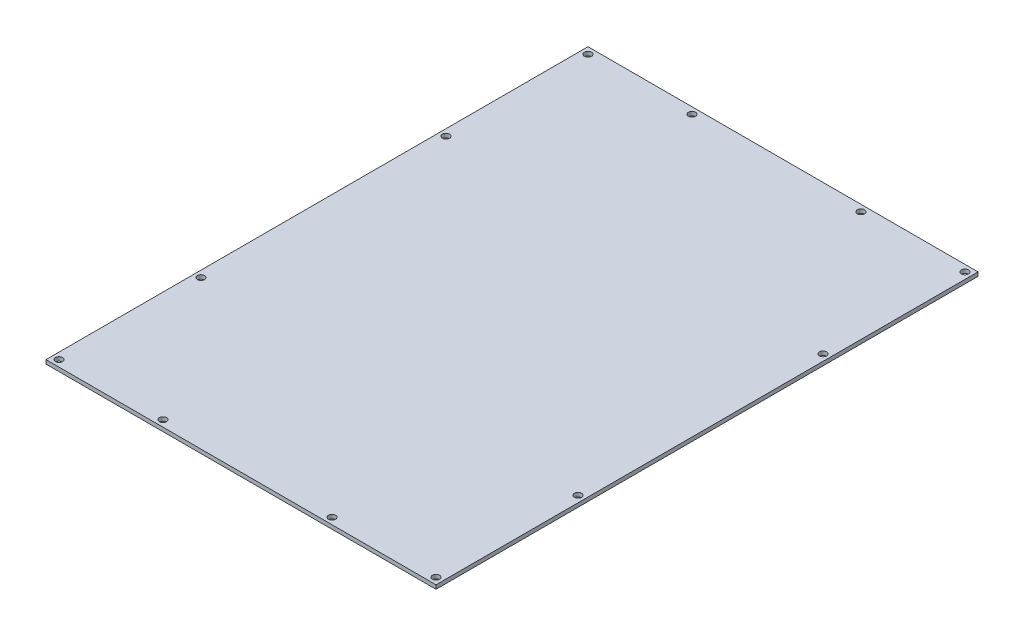
ISO-10303-21;
HEADER;
FILE_DESCRIPTION(('STEP AP214'),'2;1');
FILE_NAME('part.step','',(''),(''),'','','');
FILE_SCHEMA(('AUTOMOTIVE_DESIGN { 1 0 10303 214 1 1 1 1 }'));
ENDSEC;
DATA;
#1=APPLICATION_CONTEXT('core data for automotive mechanical design processes');
#2=APPLICATION_PROTOCOL_DEFINITION('international standard','automotive_design',2000,#1);
#3=PRODUCT_CONTEXT('',#1,'mechanical');
#4=PRODUCT('Part','Part','',(#3));
#5=PRODUCT_RELATED_PRODUCT_CATEGORY('part','',(#4));
#6=PRODUCT_DEFINITION_FORMATION('','',#4);
#7=PRODUCT_DEFINITION_CONTEXT('part definition',#1,'design');
#8=PRODUCT_DEFINITION('design','',#6,#7);
#9=PRODUCT_DEFINITION_SHAPE('','',#8);
#10=(LENGTH_UNIT() NAMED_UNIT(*) SI_UNIT(.MILLI.,.METRE.));
#11=(NAMED_UNIT(*) PLANE_ANGLE_UNIT() SI_UNIT($,.RADIAN.));
#12=(NAMED_UNIT(*) SI_UNIT($,.STERADIAN.) SOLID_ANGLE_UNIT());
#13=UNCERTAINTY_MEASURE_WITH_UNIT(LENGTH_MEASURE(1.E-05),#10,'distance_accuracy_value','');
#14=(GEOMETRIC_REPRESENTATION_CONTEXT(3) GLOBAL_UNCERTAINTY_ASSIGNED_CONTEXT((#13)) GLOBAL_UNIT_ASSIGNED_CONTEXT((#10,
#11,#12)) REPRESENTATION_CONTEXT('',''));
#15=CARTESIAN_POINT('',(0.,0.,0.));
#16=DIRECTION('',(0.,0.,1.));
#17=DIRECTION('',(1.,0.,0.));
#18=AXIS2_PLACEMENT_3D('',#15,#16,#17);
#19=CARTESIAN_POINT('',(150.,3.,-208.45));
#20=DIRECTION('',(-1.,0.,0.));
#21=DIRECTION('',(0.,0.,1.));
#22=AXIS2_PLACEMENT_3D('',#19,#20,#21);
#23=PLANE('',#22);
#24=DIRECTION('',(0.,0.,-1.));
#25=VECTOR('',#24,1.);
#26=CARTESIAN_POINT('',(150.,0.,-208.45));
#27=LINE('',#26,#25);
#28=CARTESIAN_POINT('',(150.,0.,208.45));
#29=VERTEX_POINT('',#28);
#30=CARTESIAN_POINT('',(150.,0.,-208.45));
#31=VERTEX_POINT('',#30);
#32=EDGE_CURVE('E107',#29,#31,#27,.T.);
#33=ORIENTED_EDGE('',*,*,#32,.T.);
#34=DIRECTION('',(0.,-1.,0.));
#35=VECTOR('',#34,1.);
#36=CARTESIAN_POINT('',(150.,3.,-208.45));
#37=LINE('',#36,#35);
#38=CARTESIAN_POINT('',(150.,3.,-208.45));
#39=VERTEX_POINT('',#38);
#40=EDGE_CURVE('E11',#39,#31,#37,.T.);
#41=ORIENTED_EDGE('',*,*,#40,.F.);
#42=DIRECTION('',(0.,0.,-1.));
#43=VECTOR('',#42,1.);
#44=CARTESIAN_POINT('',(150.,3.,-208.45));
#45=LINE('',#44,#43);
#46=CARTESIAN_POINT('',(150.,3.,208.45));
#47=VERTEX_POINT('',#46);
#48=EDGE_CURVE('E94',#47,#39,#45,.T.);
#49=ORIENTED_EDGE('',*,*,#48,.F.);
#50=DIRECTION('',(0.,-1.,0.));
#51=VECTOR('',#50,1.);
#52=CARTESIAN_POINT('',(150.,3.,208.45));
#53=LINE('',#52,#51);
#54=EDGE_CURVE('E103',#47,#29,#53,.T.);
#55=ORIENTED_EDGE('',*,*,#54,.T.);
#56=EDGE_LOOP('',(#33,#41,#49,#55));
#57=FACE_BOUND('',#56,.T.);
#58=ADVANCED_FACE('F41',(#57),#23,.F.);
#59=CARTESIAN_POINT('',(-150.,3.,-208.45));
#60=DIRECTION('',(0.,0.,1.));
#61=DIRECTION('',(1.,0.,0.));
#62=AXIS2_PLACEMENT_3D('',#59,#60,#61);
#63=PLANE('',#62);
#64=DIRECTION('',(-1.,0.,0.));
#65=VECTOR('',#64,1.);
#66=CARTESIAN_POINT('',(-150.,0.,-208.45));
#67=LINE('',#66,#65);
#68=CARTESIAN_POINT('',(-150.,0.,-208.45));
#69=VERTEX_POINT('',#68);
#70=EDGE_CURVE('E98',#31,#69,#67,.T.);
#71=ORIENTED_EDGE('',*,*,#70,.T.);
#72=DIRECTION('',(0.,-1.,0.));
#73=VECTOR('',#72,1.);
#74=CARTESIAN_POINT('',(-150.,3.,-208.45));
#75=LINE('',#74,#73);
#76=CARTESIAN_POINT('',(-150.,3.,-208.45));
#77=VERTEX_POINT('',#76);
#78=EDGE_CURVE('E50',#77,#69,#75,.T.);
#79=ORIENTED_EDGE('',*,*,#78,.F.);
#80=DIRECTION('',(-1.,0.,0.));
#81=VECTOR('',#80,1.);
#82=CARTESIAN_POINT('',(-150.,3.,-208.45));
#83=LINE('',#82,#81);
#84=EDGE_CURVE('E89',#39,#77,#83,.T.);
#85=ORIENTED_EDGE('',*,*,#84,.F.);
#86=ORIENTED_EDGE('',*,*,#40,.T.);
#87=EDGE_LOOP('',(#71,#79,#85,#86));
#88=FACE_BOUND('',#87,.T.);
#89=ADVANCED_FACE('F97',(#88),#63,.F.);
#90=CARTESIAN_POINT('',(-150.,3.,-208.45));
#91=DIRECTION('',(1.,0.,0.));
#92=DIRECTION('',(0.,0.,-1.));
#93=AXIS2_PLACEMENT_3D('',#90,#91,#92);
#94=PLANE('',#93);
#95=DIRECTION('',(0.,0.,1.));
#96=VECTOR('',#95,1.);
#97=CARTESIAN_POINT('',(-150.,0.,-208.45));
#98=LINE('',#97,#96);
#99=CARTESIAN_POINT('',(-150.,0.,208.45));
#100=VERTEX_POINT('',#99);
#101=EDGE_CURVE('E76',#69,#100,#98,.T.);
#102=ORIENTED_EDGE('',*,*,#101,.T.);
#103=DIRECTION('',(0.,-1.,0.));
#104=VECTOR('',#103,1.);
#105=CARTESIAN_POINT('',(-150.,3.,208.45));
#106=LINE('',#105,#104);
#107=CARTESIAN_POINT('',(-150.,3.,208.45));
#108=VERTEX_POINT('',#107);
#109=EDGE_CURVE('E99',#108,#100,#106,.T.);
#110=ORIENTED_EDGE('',*,*,#109,.F.);
#111=DIRECTION('',(0.,0.,1.));
#112=VECTOR('',#111,1.);
#113=CARTESIAN_POINT('',(-150.,3.,-208.45));
#114=LINE('',#113,#112);
#115=EDGE_CURVE('E92',#77,#108,#114,.T.);
#116=ORIENTED_EDGE('',*,*,#115,.F.);
#117=ORIENTED_EDGE('',*,*,#78,.T.);
#118=EDGE_LOOP('',(#102,#110,#116,#117));
#119=FACE_BOUND('',#118,.T.);
#120=ADVANCED_FACE('F101',(#119),#94,.F.);
#121=CARTESIAN_POINT('',(-150.,3.,208.45));
#122=DIRECTION('',(0.,0.,-1.));
#123=DIRECTION('',(-1.,0.,0.));
#124=AXIS2_PLACEMENT_3D('',#121,#122,#123);
#125=PLANE('',#124);
#126=DIRECTION('',(1.,0.,0.));
#127=VECTOR('',#126,1.);
#128=CARTESIAN_POINT('',(-150.,0.,208.45));
#129=LINE('',#128,#127);
#130=EDGE_CURVE('E82',#100,#29,#129,.T.);
#131=ORIENTED_EDGE('',*,*,#130,.T.);
#132=ORIENTED_EDGE('',*,*,#54,.F.);
#133=DIRECTION('',(1.,0.,0.));
#134=VECTOR('',#133,1.);
#135=CARTESIAN_POINT('',(-150.,3.,208.45));
#136=LINE('',#135,#134);
#137=EDGE_CURVE('E59',#108,#47,#136,.T.);
#138=ORIENTED_EDGE('',*,*,#137,.F.);
#139=ORIENTED_EDGE('',*,*,#109,.T.);
#140=EDGE_LOOP('',(#131,#132,#138,#139));
#141=FACE_BOUND('',#140,.T.);
#142=ADVANCED_FACE('F193',(#141),#125,.F.);
#143=CARTESIAN_POINT('',(0.,3.,0.));
#144=DIRECTION('',(0.,1.,0.));
#145=DIRECTION('',(0.,0.,1.));
#146=AXIS2_PLACEMENT_3D('',#143,#144,#145);
#147=PLANE('',#146);
#148=CARTESIAN_POINT('',(-145.,3.,-203.45));
#149=DIRECTION('',(0.,1.,0.));
#150=DIRECTION('',(0.,0.,1.));
#151=AXIS2_PLACEMENT_3D('',#148,#149,#150);
#152=CIRCLE('',#151,2.75);
#153=CARTESIAN_POINT('',(-145.,3.,-200.7));
#154=VERTEX_POINT('',#153);
#155=EDGE_CURVE('E163',#154,#154,#152,.T.);
#156=ORIENTED_EDGE('',*,*,#155,.F.);
#157=EDGE_LOOP('',(#156));
#158=FACE_BOUND('',#157,.T.);
#159=CARTESIAN_POINT('',(145.,3.,203.45));
#160=DIRECTION('',(0.,1.,0.));
#161=DIRECTION('',(0.,0.,1.));
#162=AXIS2_PLACEMENT_3D('',#159,#160,#161);
#163=CIRCLE('',#162,2.75);
#164=CARTESIAN_POINT('',(145.,3.,206.2));
#165=VERTEX_POINT('',#164);
#166=EDGE_CURVE('E153',#165,#165,#163,.T.);
#167=ORIENTED_EDGE('',*,*,#166,.F.);
#168=EDGE_LOOP('',(#167));
#169=FACE_BOUND('',#168,.T.);
#170=CARTESIAN_POINT('',(-145.,3.,203.45));
#171=DIRECTION('',(0.,1.,0.));
#172=DIRECTION('',(0.,0.,1.));
#173=AXIS2_PLACEMENT_3D('',#170,#171,#172);
#174=CIRCLE('',#173,2.75);
#175=CARTESIAN_POINT('',(-145.,3.,206.2));
#176=VERTEX_POINT('',#175);
#177=EDGE_CURVE('E150',#176,#176,#174,.T.);
#178=ORIENTED_EDGE('',*,*,#177,.F.);
#179=EDGE_LOOP('',(#178));
#180=FACE_BOUND('',#179,.T.);
#181=CARTESIAN_POINT('',(145.,3.,-203.45));
#182=DIRECTION('',(0.,1.,0.));
#183=DIRECTION('',(0.,0.,1.));
#184=AXIS2_PLACEMENT_3D('',#181,#182,#183);
#185=CIRCLE('',#184,2.75);
#186=CARTESIAN_POINT('',(145.,3.,-200.7));
#187=VERTEX_POINT('',#186);
#188=EDGE_CURVE('E147',#187,#187,#185,.T.);
#189=ORIENTED_EDGE('',*,*,#188,.F.);
#190=EDGE_LOOP('',(#189));
#191=FACE_BOUND('',#190,.T.);
#192=CARTESIAN_POINT('',(-65.,3.,-203.45));
#193=DIRECTION('',(0.,1.,0.));
#194=DIRECTION('',(0.,0.,1.));
#195=AXIS2_PLACEMENT_3D('',#192,#193,#194);
#196=CIRCLE('',#195,2.75);
#197=CARTESIAN_POINT('',(-65.,3.,-200.7));
#198=VERTEX_POINT('',#197);
#199=EDGE_CURVE('E143',#198,#198,#196,.T.);
#200=ORIENTED_EDGE('',*,*,#199,.F.);
#201=EDGE_LOOP('',(#200));
#202=FACE_BOUND('',#201,.T.);
#203=CARTESIAN_POINT('',(65.,3.,-203.45));
#204=DIRECTION('',(0.,1.,0.));
#205=DIRECTION('',(0.,0.,1.));
#206=AXIS2_PLACEMENT_3D('',#203,#204,#205);
#207=CIRCLE('',#206,2.75);
#208=CARTESIAN_POINT('',(65.,3.,-200.7));
#209=VERTEX_POINT('',#208);
#210=EDGE_CURVE('E139',#209,#209,#207,.T.);
#211=ORIENTED_EDGE('',*,*,#210,.F.);
#212=EDGE_LOOP('',(#211));
#213=FACE_BOUND('',#212,.T.);
#214=CARTESIAN_POINT('',(-145.,3.,-94.22));
#215=DIRECTION('',(0.,1.,0.));
#216=DIRECTION('',(0.,0.,1.));
#217=AXIS2_PLACEMENT_3D('',#214,#215,#216);
#218=CIRCLE('',#217,2.75);
#219=CARTESIAN_POINT('',(-145.,3.,-91.47));
#220=VERTEX_POINT('',#219);
#221=EDGE_CURVE('E135',#220,#220,#218,.T.);
#222=ORIENTED_EDGE('',*,*,#221,.F.);
#223=EDGE_LOOP('',(#222));
#224=FACE_BOUND('',#223,.T.);
#225=CARTESIAN_POINT('',(-145.,3.,94.2199999999999));
#226=DIRECTION('',(0.,1.,0.));
#227=DIRECTION('',(0.,0.,1.));
#228=AXIS2_PLACEMENT_3D('',#225,#226,#227);
#229=CIRCLE('',#228,2.75);
#230=CARTESIAN_POINT('',(-145.,3.,96.9699999999999));
#231=VERTEX_POINT('',#230);
#232=EDGE_CURVE('E131',#231,#231,#229,.T.);
#233=ORIENTED_EDGE('',*,*,#232,.F.);
#234=EDGE_LOOP('',(#233));
#235=FACE_BOUND('',#234,.T.);
#236=CARTESIAN_POINT('',(145.,3.,-94.22));
#237=DIRECTION('',(0.,1.,0.));
#238=DIRECTION('',(0.,0.,1.));
#239=AXIS2_PLACEMENT_3D('',#236,#237,#238);
#240=CIRCLE('',#239,2.75);
#241=CARTESIAN_POINT('',(145.,3.,-91.47));
#242=VERTEX_POINT('',#241);
#243=EDGE_CURVE('E130',#242,#242,#240,.T.);
#244=ORIENTED_EDGE('',*,*,#243,.F.);
#245=EDGE_LOOP('',(#244));
#246=FACE_BOUND('',#245,.T.);
#247=CARTESIAN_POINT('',(145.,3.,94.2199999999999));
#248=DIRECTION('',(0.,1.,0.));
#249=DIRECTION('',(0.,0.,1.));
#250=AXIS2_PLACEMENT_3D('',#247,#248,#249);
#251=CIRCLE('',#250,2.75);
#252=CARTESIAN_POINT('',(145.,3.,96.9699999999999));
#253=VERTEX_POINT('',#252);
#254=EDGE_CURVE('E126',#253,#253,#251,.T.);
#255=ORIENTED_EDGE('',*,*,#254,.F.);
#256=EDGE_LOOP('',(#255));
#257=FACE_BOUND('',#256,.T.);
#258=CARTESIAN_POINT('',(-65.,3.,203.45));
#259=DIRECTION('',(0.,1.,0.));
#260=DIRECTION('',(0.,0.,1.));
#261=AXIS2_PLACEMENT_3D('',#258,#259,#260);
#262=CIRCLE('',#261,2.75);
#263=CARTESIAN_POINT('',(-65.,3.,206.2));
#264=VERTEX_POINT('',#263);
#265=EDGE_CURVE('E122',#264,#264,#262,.T.);
#266=ORIENTED_EDGE('',*,*,#265,.F.);
#267=EDGE_LOOP('',(#266));
#268=FACE_BOUND('',#267,.T.);
#269=CARTESIAN_POINT('',(65.,3.,203.45));
#270=DIRECTION('',(0.,1.,0.));
#271=DIRECTION('',(0.,0.,1.));
#272=AXIS2_PLACEMENT_3D('',#269,#270,#271);
#273=CIRCLE('',#272,2.75);
#274=CARTESIAN_POINT('',(65.,3.,206.2));
#275=VERTEX_POINT('',#274);
#276=EDGE_CURVE('E118',#275,#275,#273,.T.);
#277=ORIENTED_EDGE('',*,*,#276,.F.);
#278=EDGE_LOOP('',(#277));
#279=FACE_BOUND('',#278,.T.);
#280=ORIENTED_EDGE('',*,*,#48,.T.);
#281=ORIENTED_EDGE('',*,*,#84,.T.);
#282=ORIENTED_EDGE('',*,*,#115,.T.);
#283=ORIENTED_EDGE('',*,*,#137,.T.);
#284=EDGE_LOOP('',(#280,#281,#282,#283));
#285=FACE_BOUND('',#284,.T.);
#286=ADVANCED_FACE('F90',(#158,#169,#180,#191,#202,#213,#224,#235,#246,#257,#268,#279,#285),
#147,.T.);
#287=CARTESIAN_POINT('',(0.,0.,0.));
#288=DIRECTION('',(0.,1.,0.));
#289=DIRECTION('',(0.,0.,1.));
#290=AXIS2_PLACEMENT_3D('',#287,#288,#289);
#291=PLANE('',#290);
#292=CARTESIAN_POINT('',(-145.,0.,-203.45));
#293=DIRECTION('',(0.,1.,0.));
#294=DIRECTION('',(0.,0.,1.));
#295=AXIS2_PLACEMENT_3D('',#292,#293,#294);
#296=CIRCLE('',#295,2.75);
#297=CARTESIAN_POINT('',(-145.,0.,-200.7));
#298=VERTEX_POINT('',#297);
#299=EDGE_CURVE('E44',#298,#298,#296,.T.);
#300=ORIENTED_EDGE('',*,*,#299,.T.);
#301=EDGE_LOOP('',(#300));
#302=FACE_BOUND('',#301,.T.);
#303=CARTESIAN_POINT('',(145.,0.,203.45));
#304=DIRECTION('',(0.,1.,0.));
#305=DIRECTION('',(0.,0.,1.));
#306=AXIS2_PLACEMENT_3D('',#303,#304,#305);
#307=CIRCLE('',#306,2.75);
#308=CARTESIAN_POINT('',(145.,0.,206.2));
#309=VERTEX_POINT('',#308);
#310=EDGE_CURVE('E151',#309,#309,#307,.T.);
#311=ORIENTED_EDGE('',*,*,#310,.T.);
#312=EDGE_LOOP('',(#311));
#313=FACE_BOUND('',#312,.T.);
#314=CARTESIAN_POINT('',(-145.,0.,203.45));
#315=DIRECTION('',(0.,1.,0.));
#316=DIRECTION('',(0.,0.,1.));
#317=AXIS2_PLACEMENT_3D('',#314,#315,#316);
#318=CIRCLE('',#317,2.75);
#319=CARTESIAN_POINT('',(-145.,0.,206.2));
#320=VERTEX_POINT('',#319);
#321=EDGE_CURVE('E148',#320,#320,#318,.T.);
#322=ORIENTED_EDGE('',*,*,#321,.T.);
#323=EDGE_LOOP('',(#322));
#324=FACE_BOUND('',#323,.T.);
#325=CARTESIAN_POINT('',(145.,0.,-203.45));
#326=DIRECTION('',(0.,1.,0.));
#327=DIRECTION('',(0.,0.,1.));
#328=AXIS2_PLACEMENT_3D('',#325,#326,#327);
#329=CIRCLE('',#328,2.75);
#330=CARTESIAN_POINT('',(145.,0.,-200.7));
#331=VERTEX_POINT('',#330);
#332=EDGE_CURVE('E144',#331,#331,#329,.T.);
#333=ORIENTED_EDGE('',*,*,#332,.T.);
#334=EDGE_LOOP('',(#333));
#335=FACE_BOUND('',#334,.T.);
#336=CARTESIAN_POINT('',(-65.,0.,-203.45));
#337=DIRECTION('',(0.,1.,0.));
#338=DIRECTION('',(0.,0.,1.));
#339=AXIS2_PLACEMENT_3D('',#336,#337,#338);
#340=CIRCLE('',#339,2.75);
#341=CARTESIAN_POINT('',(-65.,0.,-200.7));
#342=VERTEX_POINT('',#341);
#343=EDGE_CURVE('E140',#342,#342,#340,.T.);
#344=ORIENTED_EDGE('',*,*,#343,.T.);
#345=EDGE_LOOP('',(#344));
#346=FACE_BOUND('',#345,.T.);
#347=CARTESIAN_POINT('',(65.,0.,-203.45));
#348=DIRECTION('',(0.,1.,0.));
#349=DIRECTION('',(0.,0.,1.));
#350=AXIS2_PLACEMENT_3D('',#347,#348,#349);
#351=CIRCLE('',#350,2.75);
#352=CARTESIAN_POINT('',(65.,0.,-200.7));
#353=VERTEX_POINT('',#352);
#354=EDGE_CURVE('E136',#353,#353,#351,.T.);
#355=ORIENTED_EDGE('',*,*,#354,.T.);
#356=EDGE_LOOP('',(#355));
#357=FACE_BOUND('',#356,.T.);
#358=CARTESIAN_POINT('',(-145.,0.,-94.22));
#359=DIRECTION('',(0.,1.,0.));
#360=DIRECTION('',(0.,0.,1.));
#361=AXIS2_PLACEMENT_3D('',#358,#359,#360);
#362=CIRCLE('',#361,2.75);
#363=CARTESIAN_POINT('',(-145.,0.,-91.47));
#364=VERTEX_POINT('',#363);
#365=EDGE_CURVE('E132',#364,#364,#362,.T.);
#366=ORIENTED_EDGE('',*,*,#365,.T.);
#367=EDGE_LOOP('',(#366));
#368=FACE_BOUND('',#367,.T.);
#369=CARTESIAN_POINT('',(-145.,0.,94.2199999999999));
#370=DIRECTION('',(0.,1.,0.));
#371=DIRECTION('',(0.,0.,1.));
#372=AXIS2_PLACEMENT_3D('',#369,#370,#371);
#373=CIRCLE('',#372,2.75);
#374=CARTESIAN_POINT('',(-145.,0.,96.9699999999999));
#375=VERTEX_POINT('',#374);
#376=EDGE_CURVE('E127',#375,#375,#373,.T.);
#377=ORIENTED_EDGE('',*,*,#376,.T.);
#378=EDGE_LOOP('',(#377));
#379=FACE_BOUND('',#378,.T.);
#380=CARTESIAN_POINT('',(145.,0.,-94.22));
#381=DIRECTION('',(0.,1.,0.));
#382=DIRECTION('',(0.,0.,1.));
#383=AXIS2_PLACEMENT_3D('',#380,#381,#382);
#384=CIRCLE('',#383,2.75);
#385=CARTESIAN_POINT('',(145.,0.,-91.47));
#386=VERTEX_POINT('',#385);
#387=EDGE_CURVE('E178',#386,#386,#384,.T.);
#388=ORIENTED_EDGE('',*,*,#387,.T.);
#389=EDGE_LOOP('',(#388));
#390=FACE_BOUND('',#389,.T.);
#391=CARTESIAN_POINT('',(145.,0.,94.2199999999999));
#392=DIRECTION('',(0.,1.,0.));
#393=DIRECTION('',(0.,0.,1.));
#394=AXIS2_PLACEMENT_3D('',#391,#392,#393);
#395=CIRCLE('',#394,2.75);
#396=CARTESIAN_POINT('',(145.,0.,96.9699999999999));
#397=VERTEX_POINT('',#396);
#398=EDGE_CURVE('E123',#397,#397,#395,.T.);
#399=ORIENTED_EDGE('',*,*,#398,.T.);
#400=EDGE_LOOP('',(#399));
#401=FACE_BOUND('',#400,.T.);
#402=CARTESIAN_POINT('',(-65.,0.,203.45));
#403=DIRECTION('',(0.,1.,0.));
#404=DIRECTION('',(0.,0.,1.));
#405=AXIS2_PLACEMENT_3D('',#402,#403,#404);
#406=CIRCLE('',#405,2.75);
#407=CARTESIAN_POINT('',(-65.,0.,206.2));
#408=VERTEX_POINT('',#407);
#409=EDGE_CURVE('E119',#408,#408,#406,.T.);
#410=ORIENTED_EDGE('',*,*,#409,.T.);
#411=EDGE_LOOP('',(#410));
#412=FACE_BOUND('',#411,.T.);
#413=CARTESIAN_POINT('',(65.,0.,203.45));
#414=DIRECTION('',(0.,1.,0.));
#415=DIRECTION('',(0.,0.,1.));
#416=AXIS2_PLACEMENT_3D('',#413,#414,#415);
#417=CIRCLE('',#416,2.75);
#418=CARTESIAN_POINT('',(65.,0.,206.2));
#419=VERTEX_POINT('',#418);
#420=EDGE_CURVE('E110',#419,#419,#417,.T.);
#421=ORIENTED_EDGE('',*,*,#420,.T.);
#422=EDGE_LOOP('',(#421));
#423=FACE_BOUND('',#422,.T.);
#424=ORIENTED_EDGE('',*,*,#32,.F.);
#425=ORIENTED_EDGE('',*,*,#130,.F.);
#426=ORIENTED_EDGE('',*,*,#101,.F.);
#427=ORIENTED_EDGE('',*,*,#70,.F.);
#428=EDGE_LOOP('',(#424,#425,#426,#427));
#429=FACE_BOUND('',#428,.T.);
#430=ADVANCED_FACE('F192',(#302,#313,#324,#335,#346,#357,#368,#379,#390,#401,#412,#423,#429),
#291,.F.);
#431=CARTESIAN_POINT('',(65.,3.,203.45));
#432=DIRECTION('',(0.,1.,0.));
#433=DIRECTION('',(0.,0.,1.));
#434=AXIS2_PLACEMENT_3D('',#431,#432,#433);
#435=CYLINDRICAL_SURFACE('',#434,2.75);
#436=ORIENTED_EDGE('',*,*,#276,.T.);
#437=EDGE_LOOP('',(#436));
#438=FACE_BOUND('',#437,.T.);
#439=ORIENTED_EDGE('',*,*,#420,.F.);
#440=EDGE_LOOP('',(#439));
#441=FACE_BOUND('',#440,.T.);
#442=ADVANCED_FACE('F188',(#438,#441),#435,.F.);
#443=CARTESIAN_POINT('',(-65.,3.,203.45));
#444=DIRECTION('',(0.,1.,0.));
#445=DIRECTION('',(0.,0.,1.));
#446=AXIS2_PLACEMENT_3D('',#443,#444,#445);
#447=CYLINDRICAL_SURFACE('',#446,2.75);
#448=ORIENTED_EDGE('',*,*,#265,.T.);
#449=EDGE_LOOP('',(#448));
#450=FACE_BOUND('',#449,.T.);
#451=ORIENTED_EDGE('',*,*,#409,.F.);
#452=EDGE_LOOP('',(#451));
#453=FACE_BOUND('',#452,.T.);
#454=ADVANCED_FACE('F244',(#450,#453),#447,.F.);
#455=CARTESIAN_POINT('',(145.,3.,94.2199999999999));
#456=DIRECTION('',(0.,1.,0.));
#457=DIRECTION('',(0.,0.,1.));
#458=AXIS2_PLACEMENT_3D('',#455,#456,#457);
#459=CYLINDRICAL_SURFACE('',#458,2.75);
#460=ORIENTED_EDGE('',*,*,#254,.T.);
#461=EDGE_LOOP('',(#460));
#462=FACE_BOUND('',#461,.T.);
#463=ORIENTED_EDGE('',*,*,#398,.F.);
#464=EDGE_LOOP('',(#463));
#465=FACE_BOUND('',#464,.T.);
#466=ADVANCED_FACE('F252',(#462,#465),#459,.F.);
#467=CARTESIAN_POINT('',(145.,3.,-94.22));
#468=DIRECTION('',(0.,1.,0.));
#469=DIRECTION('',(0.,0.,1.));
#470=AXIS2_PLACEMENT_3D('',#467,#468,#469);
#471=CYLINDRICAL_SURFACE('',#470,2.75);
#472=ORIENTED_EDGE('',*,*,#243,.T.);
#473=EDGE_LOOP('',(#472));
#474=FACE_BOUND('',#473,.T.);
#475=ORIENTED_EDGE('',*,*,#387,.F.);
#476=EDGE_LOOP('',(#475));
#477=FACE_BOUND('',#476,.T.);
#478=ADVANCED_FACE('F262',(#474,#477),#471,.F.);
#479=CARTESIAN_POINT('',(-145.,3.,94.2199999999999));
#480=DIRECTION('',(0.,1.,0.));
#481=DIRECTION('',(0.,0.,1.));
#482=AXIS2_PLACEMENT_3D('',#479,#480,#481);
#483=CYLINDRICAL_SURFACE('',#482,2.75);
#484=ORIENTED_EDGE('',*,*,#232,.T.);
#485=EDGE_LOOP('',(#484));
#486=FACE_BOUND('',#485,.T.);
#487=ORIENTED_EDGE('',*,*,#376,.F.);
#488=EDGE_LOOP('',(#487));
#489=FACE_BOUND('',#488,.T.);
#490=ADVANCED_FACE('F272',(#486,#489),#483,.F.);
#491=CARTESIAN_POINT('',(-145.,3.,-94.22));
#492=DIRECTION('',(0.,1.,0.));
#493=DIRECTION('',(0.,0.,1.));
#494=AXIS2_PLACEMENT_3D('',#491,#492,#493);
#495=CYLINDRICAL_SURFACE('',#494,2.75);
#496=ORIENTED_EDGE('',*,*,#221,.T.);
#497=EDGE_LOOP('',(#496));
#498=FACE_BOUND('',#497,.T.);
#499=ORIENTED_EDGE('',*,*,#365,.F.);
#500=EDGE_LOOP('',(#499));
#501=FACE_BOUND('',#500,.T.);
#502=ADVANCED_FACE('F282',(#498,#501),#495,.F.);
#503=CARTESIAN_POINT('',(65.,3.,-203.45));
#504=DIRECTION('',(0.,1.,0.));
#505=DIRECTION('',(0.,0.,1.));
#506=AXIS2_PLACEMENT_3D('',#503,#504,#505);
#507=CYLINDRICAL_SURFACE('',#506,2.75);
#508=ORIENTED_EDGE('',*,*,#210,.T.);
#509=EDGE_LOOP('',(#508));
#510=FACE_BOUND('',#509,.T.);
#511=ORIENTED_EDGE('',*,*,#354,.F.);
#512=EDGE_LOOP('',(#511));
#513=FACE_BOUND('',#512,.T.);
#514=ADVANCED_FACE('F292',(#510,#513),#507,.F.);
#515=CARTESIAN_POINT('',(-65.,3.,-203.45));
#516=DIRECTION('',(0.,1.,0.));
#517=DIRECTION('',(0.,0.,1.));
#518=AXIS2_PLACEMENT_3D('',#515,#516,#517);
#519=CYLINDRICAL_SURFACE('',#518,2.75);
#520=ORIENTED_EDGE('',*,*,#199,.T.);
#521=EDGE_LOOP('',(#520));
#522=FACE_BOUND('',#521,.T.);
#523=ORIENTED_EDGE('',*,*,#343,.F.);
#524=EDGE_LOOP('',(#523));
#525=FACE_BOUND('',#524,.T.);
#526=ADVANCED_FACE('F302',(#522,#525),#519,.F.);
#527=CARTESIAN_POINT('',(145.,3.,-203.45));
#528=DIRECTION('',(0.,1.,0.));
#529=DIRECTION('',(0.,0.,1.));
#530=AXIS2_PLACEMENT_3D('',#527,#528,#529);
#531=CYLINDRICAL_SURFACE('',#530,2.75);
#532=ORIENTED_EDGE('',*,*,#188,.T.);
#533=EDGE_LOOP('',(#532));
#534=FACE_BOUND('',#533,.T.);
#535=ORIENTED_EDGE('',*,*,#332,.F.);
#536=EDGE_LOOP('',(#535));
#537=FACE_BOUND('',#536,.T.);
#538=ADVANCED_FACE('F312',(#534,#537),#531,.F.);
#539=CARTESIAN_POINT('',(-145.,3.,203.45));
#540=DIRECTION('',(0.,1.,0.));
#541=DIRECTION('',(0.,0.,1.));
#542=AXIS2_PLACEMENT_3D('',#539,#540,#541);
#543=CYLINDRICAL_SURFACE('',#542,2.75);
#544=ORIENTED_EDGE('',*,*,#177,.T.);
#545=EDGE_LOOP('',(#544));
#546=FACE_BOUND('',#545,.T.);
#547=ORIENTED_EDGE('',*,*,#321,.F.);
#548=EDGE_LOOP('',(#547));
#549=FACE_BOUND('',#548,.T.);
#550=ADVANCED_FACE('F322',(#546,#549),#543,.F.);
#551=CARTESIAN_POINT('',(145.,3.,203.45));
#552=DIRECTION('',(0.,1.,0.));
#553=DIRECTION('',(0.,0.,1.));
#554=AXIS2_PLACEMENT_3D('',#551,#552,#553);
#555=CYLINDRICAL_SURFACE('',#554,2.75);
#556=ORIENTED_EDGE('',*,*,#166,.T.);
#557=EDGE_LOOP('',(#556));
#558=FACE_BOUND('',#557,.T.);
#559=ORIENTED_EDGE('',*,*,#310,.F.);
#560=EDGE_LOOP('',(#559));
#561=FACE_BOUND('',#560,.T.);
#562=ADVANCED_FACE('F332',(#558,#561),#555,.F.);
#563=CARTESIAN_POINT('',(-145.,3.,-203.45));
#564=DIRECTION('',(0.,1.,0.));
#565=DIRECTION('',(0.,0.,1.));
#566=AXIS2_PLACEMENT_3D('',#563,#564,#565);
#567=CYLINDRICAL_SURFACE('',#566,2.75);
#568=ORIENTED_EDGE('',*,*,#155,.T.);
#569=EDGE_LOOP('',(#568));
#570=FACE_BOUND('',#569,.T.);
#571=ORIENTED_EDGE('',*,*,#299,.F.);
#572=EDGE_LOOP('',(#571));
#573=FACE_BOUND('',#572,.T.);
#574=ADVANCED_FACE('F342',(#570,#573),#567,.F.);
#575=CLOSED_SHELL('',(#58,#89,#120,#142,#286,#430,#442,#454,#466,#478,#490,#502,#514,#526,#538,
#550,#562,#574));
#576=MANIFOLD_SOLID_BREP('B2',#575);
#577=ADVANCED_BREP_SHAPE_REPRESENTATION('',(#18,#576),#14);
#578=SHAPE_DEFINITION_REPRESENTATION(#9,#577);
ENDSEC;
END-ISO-10303-21;
